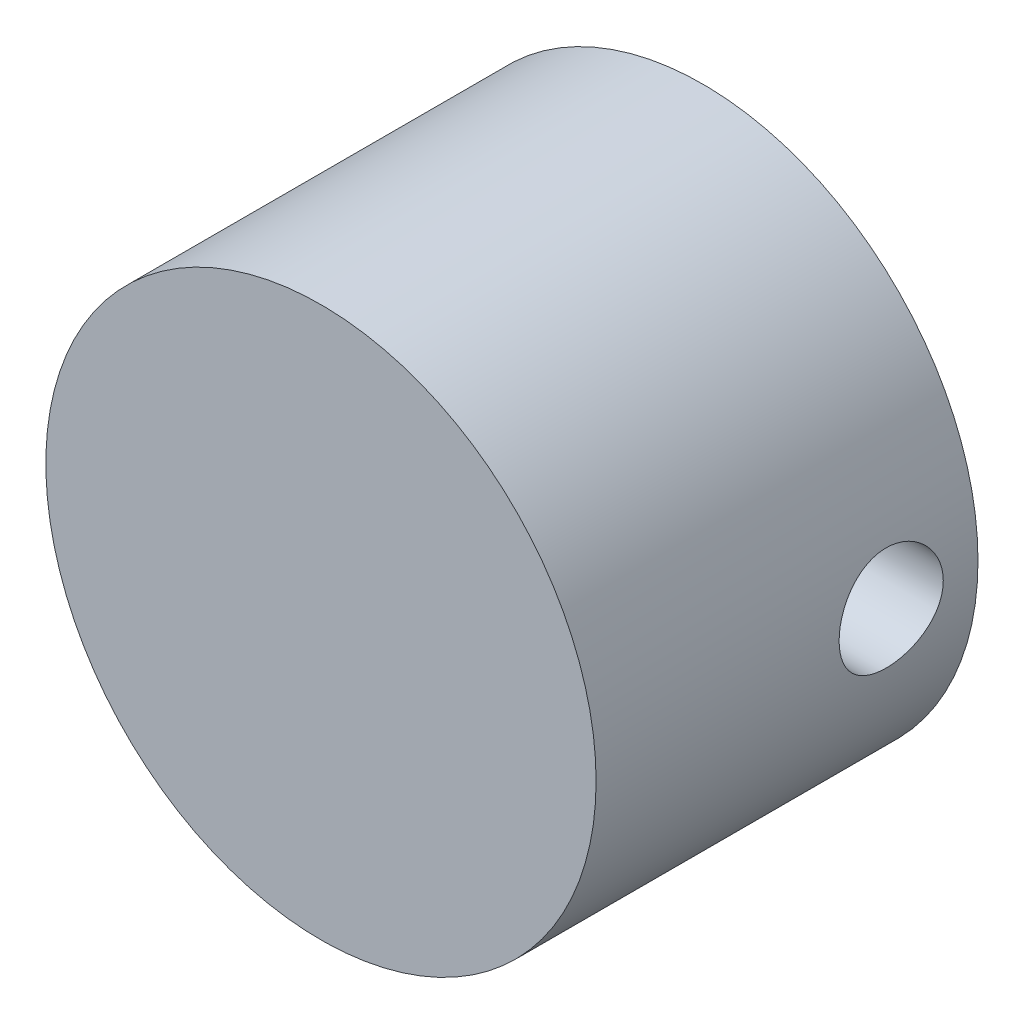
ISO-10303-21;
HEADER;
FILE_DESCRIPTION(('STEP AP214'),'2;1');
FILE_NAME('part.step','',(''),(''),'','','');
FILE_SCHEMA(('AUTOMOTIVE_DESIGN { 1 0 10303 214 1 1 1 1 }'));
ENDSEC;
DATA;
#1=APPLICATION_CONTEXT('core data for automotive mechanical design processes');
#2=APPLICATION_PROTOCOL_DEFINITION('international standard','automotive_design',2000,#1);
#3=PRODUCT_CONTEXT('',#1,'mechanical');
#4=PRODUCT('Part','Part','',(#3));
#5=PRODUCT_RELATED_PRODUCT_CATEGORY('part','',(#4));
#6=PRODUCT_DEFINITION_FORMATION('','',#4);
#7=PRODUCT_DEFINITION_CONTEXT('part definition',#1,'design');
#8=PRODUCT_DEFINITION('design','',#6,#7);
#9=PRODUCT_DEFINITION_SHAPE('','',#8);
#10=(LENGTH_UNIT() NAMED_UNIT(*) SI_UNIT(.MILLI.,.METRE.));
#11=(NAMED_UNIT(*) PLANE_ANGLE_UNIT() SI_UNIT($,.RADIAN.));
#12=(NAMED_UNIT(*) SI_UNIT($,.STERADIAN.) SOLID_ANGLE_UNIT());
#13=UNCERTAINTY_MEASURE_WITH_UNIT(LENGTH_MEASURE(1.E-05),#10,'distance_accuracy_value','');
#14=(GEOMETRIC_REPRESENTATION_CONTEXT(3) GLOBAL_UNCERTAINTY_ASSIGNED_CONTEXT((#13)) GLOBAL_UNIT_ASSIGNED_CONTEXT((#10,
#11,#12)) REPRESENTATION_CONTEXT('',''));
#15=CARTESIAN_POINT('',(0.,0.,0.));
#16=DIRECTION('',(0.,0.,1.));
#17=DIRECTION('',(1.,0.,0.));
#18=AXIS2_PLACEMENT_3D('',#15,#16,#17);
#19=CARTESIAN_POINT('',(0.,0.,11.));
#20=DIRECTION('',(0.,0.,-1.));
#21=DIRECTION('',(-1.,0.,0.));
#22=AXIS2_PLACEMENT_3D('',#19,#20,#21);
#23=CYLINDRICAL_SURFACE('',#22,7.925);
#24=CARTESIAN_POINT('',(-7.925,0.,4.));
#25=CARTESIAN_POINT('',(-7.92499848371948,-0.083457039597783,3.9999968266331));
#26=CARTESIAN_POINT('',(-7.92366808859329,-0.166955202672544,3.993011386703));
#27=CARTESIAN_POINT('',(-7.91848912344264,-0.331597599956485,3.96527276435164));
#28=CARTESIAN_POINT('',(-7.91463844543031,-0.412739804234121,3.94450805662156));
#29=CARTESIAN_POINT('',(-7.90484955579841,-0.570265475447111,3.88987029294533));
#30=CARTESIAN_POINT('',(-7.89891324575618,-0.646653202850343,3.85600917483926));
#31=CARTESIAN_POINT('',(-7.88560092752527,-0.792656462406949,3.7761738900785));
#32=CARTESIAN_POINT('',(-7.87822503160065,-0.862272522005299,3.73020066787128));
#33=CARTESIAN_POINT('',(-7.86274678235363,-0.993611905934745,3.62685126288895));
#34=CARTESIAN_POINT('',(-7.85463737509997,-1.05524073071637,3.56935603152391));
#35=CARTESIAN_POINT('',(-7.83865829437125,-1.16803861203772,3.44485075135066));
#36=CARTESIAN_POINT('',(-7.83078863835487,-1.21920690838369,3.37784001162501));
#37=CARTESIAN_POINT('',(-7.81611148057603,-1.31002556993215,3.23553642075422));
#38=CARTESIAN_POINT('',(-7.80931307109212,-1.34957956815894,3.1601810474931));
#39=CARTESIAN_POINT('',(-7.7976476449595,-1.41542987431425,3.00374454433975));
#40=CARTESIAN_POINT('',(-7.79278045843732,-1.44172734836295,2.92266391878926));
#41=CARTESIAN_POINT('',(-7.78559960520081,-1.48001435057426,2.75809040532861));
#42=CARTESIAN_POINT('',(-7.78325652573322,-1.49216882030728,2.67463719894862));
#43=CARTESIAN_POINT('',(-7.78130052045626,-1.5023368114327,2.5068456424184));
#44=CARTESIAN_POINT('',(-7.78168734509969,-1.50035162536534,2.4225073738776));
#45=CARTESIAN_POINT('',(-7.78512067069891,-1.48243034962562,2.25653635426558));
#46=CARTESIAN_POINT('',(-7.78813137294877,-1.46668202838643,2.17488247819573));
#47=CARTESIAN_POINT('',(-7.79641697404718,-1.42197732018187,2.01539709597204));
#48=CARTESIAN_POINT('',(-7.80169197076541,-1.39302036229574,1.93756575520185));
#49=CARTESIAN_POINT('',(-7.81394911022026,-1.32253733306208,1.78738653381664));
#50=CARTESIAN_POINT('',(-7.82094147446446,-1.28093563638314,1.71507501485823));
#51=CARTESIAN_POINT('',(-7.83583875379596,-1.18639751632359,1.57838840075111));
#52=CARTESIAN_POINT('',(-7.8437437631594,-1.13345992146228,1.51401412694189));
#53=CARTESIAN_POINT('',(-7.85973149746342,-1.01674131650945,1.39394467127644));
#54=CARTESIAN_POINT('',(-7.86781503708303,-0.952799749716239,1.33840555605134));
#55=CARTESIAN_POINT('',(-7.88313235527213,-0.816425008558438,1.23881840091252));
#56=CARTESIAN_POINT('',(-7.89036612501102,-0.743991745965807,1.19477048040673));
#57=CARTESIAN_POINT('',(-7.90318387876219,-0.59252547032848,1.11939226843578));
#58=CARTESIAN_POINT('',(-7.9087657257274,-0.513484076496507,1.08807843129305));
#59=CARTESIAN_POINT('',(-7.91763423900561,-0.351133850096447,1.03921625116959));
#60=CARTESIAN_POINT('',(-7.92092115384422,-0.267825480662051,1.02166641761501));
#61=CARTESIAN_POINT('',(-7.92479525353875,-0.100648603971151,1.00104816412489));
#62=CARTESIAN_POINT('',(-7.9254222930723,-0.0168073588889623,0.997765944409168));
#63=CARTESIAN_POINT('',(-7.92401616684636,0.150225893266152,1.00520227485391));
#64=CARTESIAN_POINT('',(-7.92198313437726,0.23341793265924,1.01592012350146));
#65=CARTESIAN_POINT('',(-7.91551013384103,0.39611151113508,1.05087461556682));
#66=CARTESIAN_POINT('',(-7.91108947226884,0.475637173331645,1.07500286661635));
#67=CARTESIAN_POINT('',(-7.90033487933066,0.629514388963665,1.13597579525588));
#68=CARTESIAN_POINT('',(-7.89400081614994,0.703865585494564,1.17282134896897));
#69=CARTESIAN_POINT('',(-7.88002261530286,0.846194267061441,1.25865469738005));
#70=CARTESIAN_POINT('',(-7.87236470232106,0.914091747637859,1.3077728658971));
#71=CARTESIAN_POINT('',(-7.85662335616311,1.04075726435733,1.41658099716924));
#72=CARTESIAN_POINT('',(-7.84853988249625,1.0995244296714,1.47627196717386));
#73=CARTESIAN_POINT('',(-7.83272595988502,1.20707530089407,1.60549996146858));
#74=CARTESIAN_POINT('',(-7.82500177669041,1.25571297919608,1.67515941332335));
#75=CARTESIAN_POINT('',(-7.81090801252659,1.34059691554051,1.82178538790186));
#76=CARTESIAN_POINT('',(-7.80453838063785,1.37684363940793,1.89875163579521));
#77=CARTESIAN_POINT('',(-7.79392428679271,1.43571078202909,2.05743908597984));
#78=CARTESIAN_POINT('',(-7.78966948499935,1.45839761048839,2.13913492872799));
#79=CARTESIAN_POINT('',(-7.78374340795502,1.48970531945365,2.30526709171918));
#80=CARTESIAN_POINT('',(-7.78207183502654,1.498327820664,2.38970309505566));
#81=CARTESIAN_POINT('',(-7.78151677430078,1.50120708268881,2.5574555648878));
#82=CARTESIAN_POINT('',(-7.78258857056606,1.4956942419548,2.64076801579707));
#83=CARTESIAN_POINT('',(-7.78730022630365,1.47096429407233,2.80525567261238));
#84=CARTESIAN_POINT('',(-7.7909400697357,1.45174727252152,2.88643089186448));
#85=CARTESIAN_POINT('',(-7.800358708229,1.40025245426932,3.04421274565166));
#86=CARTESIAN_POINT('',(-7.80613334053562,1.36800006468281,3.12082793672158));
#87=CARTESIAN_POINT('',(-7.8191737643007,1.29137540467831,3.26759639076656));
#88=CARTESIAN_POINT('',(-7.82643966385813,1.24700225557352,3.33774918476099));
#89=CARTESIAN_POINT('',(-7.84178246925031,1.14659661646438,3.47075462447566));
#90=CARTESIAN_POINT('',(-7.84987005399919,1.09039662628069,3.53347961450482));
#91=CARTESIAN_POINT('',(-7.86586552302267,0.968281413042159,3.64868553291117));
#92=CARTESIAN_POINT('',(-7.87377336559303,0.902363961347241,3.7011641049006));
#93=CARTESIAN_POINT('',(-7.88860376027912,0.761958024020438,3.79483929027324));
#94=CARTESIAN_POINT('',(-7.89551657723058,0.687396256501389,3.83592765515395));
#95=CARTESIAN_POINT('',(-7.90748287021571,0.532320313335581,3.90492832592944));
#96=CARTESIAN_POINT('',(-7.91253808199661,0.451811779284626,3.93285293897888));
#97=CARTESIAN_POINT('',(-7.91919564162046,0.309228461225966,3.96909962515786));
#98=CARTESIAN_POINT('',(-7.92135992219509,0.247984316003027,3.98066734434406));
#99=CARTESIAN_POINT('',(-7.92426264826391,0.1245010591044,3.99611861459621));
#100=CARTESIAN_POINT('',(-7.92500113120017,0.0622619735995679,4.00000236744662));
#101=CARTESIAN_POINT('',(-7.925,0.,4.));
#102=B_SPLINE_CURVE_WITH_KNOTS('',3,(#24,#25,#26,#27,#28,#29,#30,#31,#32,#33,#34,#35,#36,#37,
#38,#39,#40,#41,#42,#43,#44,#45,#46,#47,#48,#49,#50,#51,#52,#53,#54,#55,#56,#57,#58,#59,#60,#61,
#62,#63,#64,#65,#66,#67,#68,#69,#70,#71,#72,#73,#74,#75,#76,#77,#78,#79,#80,#81,#82,#83,#84,#85,
#86,#87,#88,#89,#90,#91,#92,#93,#94,#95,#96,#97,#98,#99,#100,#101),.UNSPECIFIED.,.T.,.F.,(4,2,2,
2,2,2,2,2,2,2,2,2,2,2,2,2,2,2,2,2,2,2,2,2,2,2,2,2,2,2,2,2,2,2,2,2,2,2,4),(0.,0.250143412147268,
0.500496314385551,0.750621546920509,1.000727281583,1.25356442104396,1.50641992830943,
1.76131771944113,2.01619308438141,2.26806521265155,2.51991431697491,2.76838019331623,
3.01685681018847,3.26684976961555,3.5168685764329,3.77090447122562,4.02494300566498,
4.27930876041063,4.53364696479179,4.78416048544787,5.03466145389883,5.28316653775696,
5.53168874509809,5.78297250484537,6.03428021677975,6.2889923217932,6.54369485011736,
6.79713952595102,7.05055499399412,7.29986627658862,7.54917600197427,7.79800212559833,
8.04684629250405,8.29948568937352,8.55218311793758,8.80720562481342,9.06198922891165,
9.24861017312291,9.43522621651816),.UNSPECIFIED.);
#103=CARTESIAN_POINT('',(-7.925,0.,4.));
#104=VERTEX_POINT('',#103);
#105=EDGE_CURVE('E10',#104,#104,#102,.T.);
#106=ORIENTED_EDGE('',*,*,#105,.T.);
#107=EDGE_LOOP('',(#106));
#108=FACE_BOUND('',#107,.T.);
#109=CARTESIAN_POINT('',(7.925,0.,1.));
#110=CARTESIAN_POINT('',(7.92499848371948,-0.0834570395977829,1.00000317336691));
#111=CARTESIAN_POINT('',(7.92366808859329,-0.166955202672544,1.006988613297));
#112=CARTESIAN_POINT('',(7.91848912344264,-0.331597599956485,1.03472723564836));
#113=CARTESIAN_POINT('',(7.91463844543031,-0.41273980423412,1.05549194337844));
#114=CARTESIAN_POINT('',(7.90484955579841,-0.570265475447111,1.11012970705467));
#115=CARTESIAN_POINT('',(7.89891324575618,-0.646653202850343,1.14399082516074));
#116=CARTESIAN_POINT('',(7.88560092752527,-0.792656462406949,1.2238261099215));
#117=CARTESIAN_POINT('',(7.87822503160065,-0.862272522005299,1.26979933212873));
#118=CARTESIAN_POINT('',(7.86274678235363,-0.993611905934744,1.37314873711105));
#119=CARTESIAN_POINT('',(7.85463737509997,-1.05524073071637,1.43064396847609));
#120=CARTESIAN_POINT('',(7.83865829437125,-1.16803861203772,1.55514924864934));
#121=CARTESIAN_POINT('',(7.83078863835487,-1.21920690838369,1.62215998837499));
#122=CARTESIAN_POINT('',(7.81611148057603,-1.31002556993215,1.76446357924578));
#123=CARTESIAN_POINT('',(7.80931307109212,-1.34957956815894,1.8398189525069));
#124=CARTESIAN_POINT('',(7.7976476449595,-1.41542987431425,1.99625545566025));
#125=CARTESIAN_POINT('',(7.79278045843732,-1.44172734836295,2.07733608121074));
#126=CARTESIAN_POINT('',(7.78559960520081,-1.48001435057426,2.24190959467139));
#127=CARTESIAN_POINT('',(7.78325652573322,-1.49216882030728,2.32536280105138));
#128=CARTESIAN_POINT('',(7.78130052045626,-1.5023368114327,2.4931543575816));
#129=CARTESIAN_POINT('',(7.78168734509969,-1.50035162536534,2.5774926261224));
#130=CARTESIAN_POINT('',(7.78512067069891,-1.48243034962562,2.74346364573442));
#131=CARTESIAN_POINT('',(7.78813137294877,-1.46668202838643,2.82511752180427));
#132=CARTESIAN_POINT('',(7.79641697404718,-1.42197732018187,2.98460290402796));
#133=CARTESIAN_POINT('',(7.80169197076541,-1.39302036229574,3.06243424479815));
#134=CARTESIAN_POINT('',(7.81394911022026,-1.32253733306208,3.21261346618336));
#135=CARTESIAN_POINT('',(7.82094147446446,-1.28093563638314,3.28492498514177));
#136=CARTESIAN_POINT('',(7.83583875379596,-1.18639751632359,3.42161159924889));
#137=CARTESIAN_POINT('',(7.8437437631594,-1.13345992146228,3.48598587305811));
#138=CARTESIAN_POINT('',(7.85973149746342,-1.01674131650945,3.60605532872357));
#139=CARTESIAN_POINT('',(7.86781503708303,-0.952799749716239,3.66159444394866));
#140=CARTESIAN_POINT('',(7.88313235527213,-0.816425008558437,3.76118159908748));
#141=CARTESIAN_POINT('',(7.89036612501102,-0.743991745965807,3.80522951959327));
#142=CARTESIAN_POINT('',(7.90318387876219,-0.59252547032848,3.88060773156422));
#143=CARTESIAN_POINT('',(7.9087657257274,-0.513484076496507,3.91192156870695));
#144=CARTESIAN_POINT('',(7.91763423900561,-0.351133850096448,3.96078374883041));
#145=CARTESIAN_POINT('',(7.92092115384422,-0.267825480662051,3.97833358238499));
#146=CARTESIAN_POINT('',(7.92479525353875,-0.100648603971152,3.99895183587511));
#147=CARTESIAN_POINT('',(7.9254222930723,-0.0168073588889623,4.00223405559083));
#148=CARTESIAN_POINT('',(7.92401616684636,0.150225893266152,3.99479772514609));
#149=CARTESIAN_POINT('',(7.92198313437726,0.23341793265924,3.98407987649854));
#150=CARTESIAN_POINT('',(7.91551013384104,0.396111511135079,3.94912538443318));
#151=CARTESIAN_POINT('',(7.91108947226885,0.475637173331645,3.92499713338365));
#152=CARTESIAN_POINT('',(7.90033487933066,0.629514388963665,3.86402420474412));
#153=CARTESIAN_POINT('',(7.89400081614994,0.703865585494563,3.82717865103103));
#154=CARTESIAN_POINT('',(7.88002261530286,0.846194267061441,3.74134530261995));
#155=CARTESIAN_POINT('',(7.87236470232106,0.914091747637859,3.6922271341029));
#156=CARTESIAN_POINT('',(7.85662335616311,1.04075726435733,3.58341900283076));
#157=CARTESIAN_POINT('',(7.84853988249625,1.0995244296714,3.52372803282614));
#158=CARTESIAN_POINT('',(7.83272595988502,1.20707530089407,3.39450003853142));
#159=CARTESIAN_POINT('',(7.82500177669041,1.25571297919608,3.32484058667665));
#160=CARTESIAN_POINT('',(7.8109080125266,1.34059691554051,3.17821461209814));
#161=CARTESIAN_POINT('',(7.80453838063785,1.37684363940793,3.10124836420479));
#162=CARTESIAN_POINT('',(7.79392428679271,1.43571078202909,2.94256091402016));
#163=CARTESIAN_POINT('',(7.78966948499935,1.45839761048839,2.86086507127201));
#164=CARTESIAN_POINT('',(7.78374340795502,1.48970531945365,2.69473290828082));
#165=CARTESIAN_POINT('',(7.78207183502654,1.498327820664,2.61029690494434));
#166=CARTESIAN_POINT('',(7.78151677430078,1.50120708268881,2.4425444351122));
#167=CARTESIAN_POINT('',(7.78258857056606,1.4956942419548,2.35923198420293));
#168=CARTESIAN_POINT('',(7.78730022630365,1.47096429407233,2.19474432738762));
#169=CARTESIAN_POINT('',(7.7909400697357,1.45174727252152,2.11356910813552));
#170=CARTESIAN_POINT('',(7.800358708229,1.40025245426932,1.95578725434834));
#171=CARTESIAN_POINT('',(7.80613334053562,1.36800006468281,1.87917206327842));
#172=CARTESIAN_POINT('',(7.8191737643007,1.29137540467831,1.73240360923344));
#173=CARTESIAN_POINT('',(7.82643966385813,1.24700225557352,1.66225081523901));
#174=CARTESIAN_POINT('',(7.84178246925031,1.14659661646438,1.52924537552434));
#175=CARTESIAN_POINT('',(7.84987005399919,1.09039662628069,1.46652038549518));
#176=CARTESIAN_POINT('',(7.86586552302267,0.968281413042159,1.35131446708884));
#177=CARTESIAN_POINT('',(7.87377336559303,0.902363961347241,1.2988358950994));
#178=CARTESIAN_POINT('',(7.88860376027912,0.761958024020438,1.20516070972676));
#179=CARTESIAN_POINT('',(7.89551657723058,0.68739625650139,1.16407234484605));
#180=CARTESIAN_POINT('',(7.90748287021571,0.532320313335581,1.09507167407056));
#181=CARTESIAN_POINT('',(7.91253808199661,0.451811779284627,1.06714706102112));
#182=CARTESIAN_POINT('',(7.91919564162046,0.309228461225967,1.03090037484214));
#183=CARTESIAN_POINT('',(7.92135992219509,0.247984316003027,1.01933265565595));
#184=CARTESIAN_POINT('',(7.92426264826391,0.124501059104401,1.00388138540379));
#185=CARTESIAN_POINT('',(7.92500113120017,0.0622619735995683,0.999997632553378));
#186=CARTESIAN_POINT('',(7.925,0.,1.));
#187=B_SPLINE_CURVE_WITH_KNOTS('',3,(#109,#110,#111,#112,#113,#114,#115,#116,#117,#118,#119,
#120,#121,#122,#123,#124,#125,#126,#127,#128,#129,#130,#131,#132,#133,#134,#135,#136,#137,#138,
#139,#140,#141,#142,#143,#144,#145,#146,#147,#148,#149,#150,#151,#152,#153,#154,#155,#156,#157,
#158,#159,#160,#161,#162,#163,#164,#165,#166,#167,#168,#169,#170,#171,#172,#173,#174,#175,#176,
#177,#178,#179,#180,#181,#182,#183,#184,#185,#186),.UNSPECIFIED.,.T.,.F.,(4,2,2,2,2,2,2,2,2,2,2,
2,2,2,2,2,2,2,2,2,2,2,2,2,2,2,2,2,2,2,2,2,2,2,2,2,2,2,4),(0.,0.250143412147268,
0.500496314385551,0.750621546920509,1.000727281583,1.25356442104396,1.50641992830943,
1.76131771944112,2.01619308438141,2.26806521265155,2.5199143169749,2.76838019331623,
3.01685681018847,3.26684976961555,3.5168685764329,3.77090447122562,4.02494300566498,
4.27930876041063,4.53364696479179,4.78416048544787,5.03466145389883,5.28316653775695,
5.53168874509808,5.78297250484537,6.03428021677975,6.2889923217932,6.54369485011736,
6.79713952595101,7.05055499399412,7.29986627658862,7.54917600197427,7.79800212559833,
8.04684629250405,8.29948568937352,8.55218311793758,8.80720562481341,9.06198922891165,
9.2486101731229,9.43522621651815),.UNSPECIFIED.);
#188=CARTESIAN_POINT('',(7.925,0.,1.));
#189=VERTEX_POINT('',#188);
#190=EDGE_CURVE('E37',#189,#189,#187,.T.);
#191=ORIENTED_EDGE('',*,*,#190,.T.);
#192=EDGE_LOOP('',(#191));
#193=FACE_BOUND('',#192,.T.);
#194=CARTESIAN_POINT('',(0.,0.,11.));
#195=DIRECTION('',(0.,0.,1.));
#196=DIRECTION('',(1.,0.,0.));
#197=AXIS2_PLACEMENT_3D('',#194,#195,#196);
#198=CIRCLE('',#197,7.925);
#199=CARTESIAN_POINT('',(7.925,0.,11.));
#200=VERTEX_POINT('',#199);
#201=EDGE_CURVE('E41',#200,#200,#198,.T.);
#202=ORIENTED_EDGE('',*,*,#201,.F.);
#203=EDGE_LOOP('',(#202));
#204=FACE_BOUND('',#203,.T.);
#205=CARTESIAN_POINT('',(0.,0.,0.));
#206=DIRECTION('',(0.,0.,1.));
#207=DIRECTION('',(1.,0.,0.));
#208=AXIS2_PLACEMENT_3D('',#205,#206,#207);
#209=CIRCLE('',#208,7.925);
#210=CARTESIAN_POINT('',(7.925,0.,0.));
#211=VERTEX_POINT('',#210);
#212=EDGE_CURVE('E45',#211,#211,#209,.T.);
#213=ORIENTED_EDGE('',*,*,#212,.T.);
#214=EDGE_LOOP('',(#213));
#215=FACE_BOUND('',#214,.T.);
#216=ADVANCED_FACE('F27',(#108,#193,#204,#215),#23,.T.);
#217=CARTESIAN_POINT('',(0.,0.,11.));
#218=DIRECTION('',(0.,0.,1.));
#219=DIRECTION('',(1.,0.,0.));
#220=AXIS2_PLACEMENT_3D('',#217,#218,#219);
#221=PLANE('',#220);
#222=ORIENTED_EDGE('',*,*,#201,.T.);
#223=EDGE_LOOP('',(#222));
#224=FACE_BOUND('',#223,.T.);
#225=ADVANCED_FACE('F58',(#224),#221,.T.);
#226=CARTESIAN_POINT('',(0.,0.,0.));
#227=DIRECTION('',(0.,0.,1.));
#228=DIRECTION('',(1.,0.,0.));
#229=AXIS2_PLACEMENT_3D('',#226,#227,#228);
#230=PLANE('',#229);
#231=ORIENTED_EDGE('',*,*,#212,.F.);
#232=EDGE_LOOP('',(#231));
#233=FACE_BOUND('',#232,.T.);
#234=ADVANCED_FACE('F54',(#233),#230,.F.);
#235=CARTESIAN_POINT('',(-7.925,0.,2.5));
#236=DIRECTION('',(1.,0.,0.));
#237=DIRECTION('',(0.,0.,-1.));
#238=AXIS2_PLACEMENT_3D('',#235,#236,#237);
#239=CYLINDRICAL_SURFACE('',#238,1.5);
#240=ORIENTED_EDGE('',*,*,#190,.F.);
#241=EDGE_LOOP('',(#240));
#242=FACE_BOUND('',#241,.T.);
#243=ORIENTED_EDGE('',*,*,#105,.F.);
#244=EDGE_LOOP('',(#243));
#245=FACE_BOUND('',#244,.T.);
#246=ADVANCED_FACE('F50',(#242,#245),#239,.F.);
#247=CLOSED_SHELL('',(#216,#225,#234,#246));
#248=MANIFOLD_SOLID_BREP('B2',#247);
#249=ADVANCED_BREP_SHAPE_REPRESENTATION('',(#18,#248),#14);
#250=SHAPE_DEFINITION_REPRESENTATION(#9,#249);
ENDSEC;
END-ISO-10303-21;
